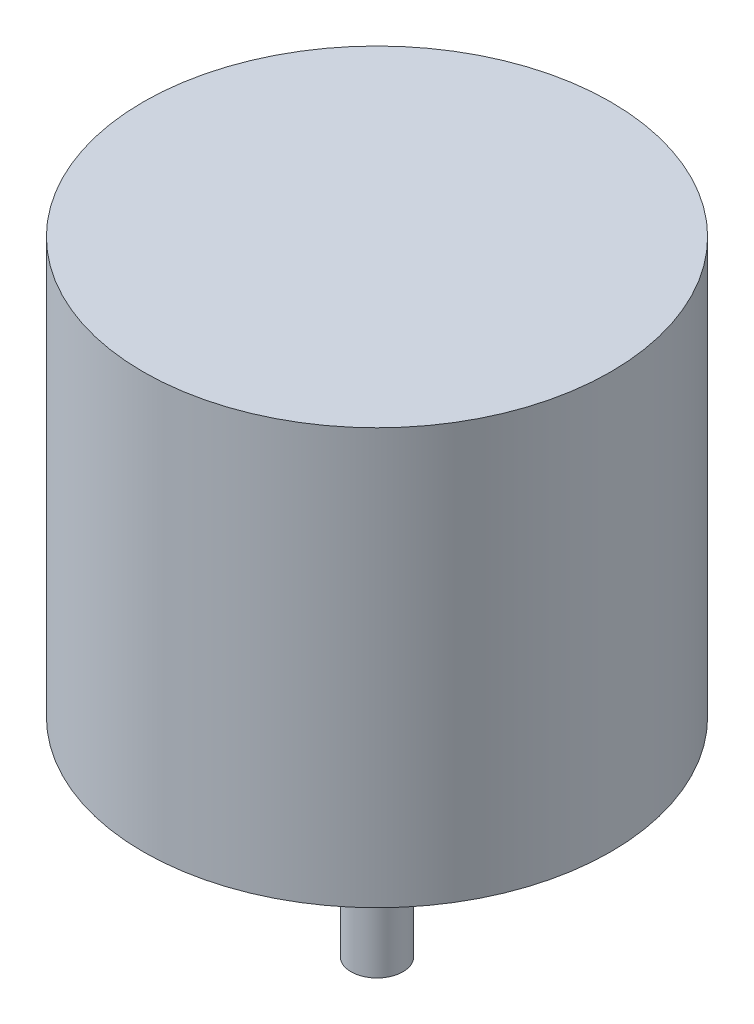
ISO-10303-21;
HEADER;
FILE_DESCRIPTION(('STEP AP214'),'2;1');
FILE_NAME('part.step','',(''),(''),'','','');
FILE_SCHEMA(('AUTOMOTIVE_DESIGN { 1 0 10303 214 1 1 1 1 }'));
ENDSEC;
DATA;
#1=APPLICATION_CONTEXT('core data for automotive mechanical design processes');
#2=APPLICATION_PROTOCOL_DEFINITION('international standard','automotive_design',2000,#1);
#3=PRODUCT_CONTEXT('',#1,'mechanical');
#4=PRODUCT('Part','Part','',(#3));
#5=PRODUCT_RELATED_PRODUCT_CATEGORY('part','',(#4));
#6=PRODUCT_DEFINITION_FORMATION('','',#4);
#7=PRODUCT_DEFINITION_CONTEXT('part definition',#1,'design');
#8=PRODUCT_DEFINITION('design','',#6,#7);
#9=PRODUCT_DEFINITION_SHAPE('','',#8);
#10=(LENGTH_UNIT() NAMED_UNIT(*) SI_UNIT(.MILLI.,.METRE.));
#11=(NAMED_UNIT(*) PLANE_ANGLE_UNIT() SI_UNIT($,.RADIAN.));
#12=(NAMED_UNIT(*) SI_UNIT($,.STERADIAN.) SOLID_ANGLE_UNIT());
#13=UNCERTAINTY_MEASURE_WITH_UNIT(LENGTH_MEASURE(1.E-05),#10,'distance_accuracy_value','');
#14=(GEOMETRIC_REPRESENTATION_CONTEXT(3) GLOBAL_UNCERTAINTY_ASSIGNED_CONTEXT((#13)) GLOBAL_UNIT_ASSIGNED_CONTEXT((#10,
#11,#12)) REPRESENTATION_CONTEXT('',''));
#15=CARTESIAN_POINT('',(0.,0.,0.));
#16=DIRECTION('',(0.,0.,1.));
#17=DIRECTION('',(1.,0.,0.));
#18=AXIS2_PLACEMENT_3D('',#15,#16,#17);
#19=CARTESIAN_POINT('',(0.,50.8,0.));
#20=DIRECTION('',(0.,-1.,0.));
#21=DIRECTION('',(0.,0.,-1.));
#22=AXIS2_PLACEMENT_3D('',#19,#20,#21);
#23=CYLINDRICAL_SURFACE('',#22,28.575);
#24=CARTESIAN_POINT('',(0.,50.8,0.));
#25=DIRECTION('',(0.,1.,0.));
#26=DIRECTION('',(0.,0.,1.));
#27=AXIS2_PLACEMENT_3D('',#24,#25,#26);
#28=CIRCLE('',#27,28.575);
#29=CARTESIAN_POINT('',(0.,50.8,28.575));
#30=VERTEX_POINT('',#29);
#31=EDGE_CURVE('E41',#30,#30,#28,.T.);
#32=ORIENTED_EDGE('',*,*,#31,.F.);
#33=EDGE_LOOP('',(#32));
#34=FACE_BOUND('',#33,.T.);
#35=CARTESIAN_POINT('',(0.,0.,0.));
#36=DIRECTION('',(0.,1.,0.));
#37=DIRECTION('',(0.,0.,1.));
#38=AXIS2_PLACEMENT_3D('',#35,#36,#37);
#39=CIRCLE('',#38,28.575);
#40=CARTESIAN_POINT('',(0.,0.,28.575));
#41=VERTEX_POINT('',#40);
#42=EDGE_CURVE('E45',#41,#41,#39,.T.);
#43=ORIENTED_EDGE('',*,*,#42,.T.);
#44=EDGE_LOOP('',(#43));
#45=FACE_BOUND('',#44,.T.);
#46=ADVANCED_FACE('F35',(#34,#45),#23,.T.);
#47=CARTESIAN_POINT('',(0.,50.8,0.));
#48=DIRECTION('',(0.,1.,0.));
#49=DIRECTION('',(0.,0.,1.));
#50=AXIS2_PLACEMENT_3D('',#47,#48,#49);
#51=PLANE('',#50);
#52=ORIENTED_EDGE('',*,*,#31,.T.);
#53=EDGE_LOOP('',(#52));
#54=FACE_BOUND('',#53,.T.);
#55=ADVANCED_FACE('F66',(#54),#51,.T.);
#56=CARTESIAN_POINT('',(0.,0.,0.));
#57=DIRECTION('',(0.,1.,0.));
#58=DIRECTION('',(0.,0.,1.));
#59=AXIS2_PLACEMENT_3D('',#56,#57,#58);
#60=PLANE('',#59);
#61=CARTESIAN_POINT('',(0.,0.,0.));
#62=DIRECTION('',(0.,1.,0.));
#63=DIRECTION('',(0.,0.,1.));
#64=AXIS2_PLACEMENT_3D('',#61,#62,#63);
#65=CIRCLE('',#64,3.175);
#66=CARTESIAN_POINT('',(0.,0.,3.175));
#67=VERTEX_POINT('',#66);
#68=EDGE_CURVE('E10',#67,#67,#65,.F.);
#69=ORIENTED_EDGE('',*,*,#68,.F.);
#70=EDGE_LOOP('',(#69));
#71=FACE_BOUND('',#70,.T.);
#72=ORIENTED_EDGE('',*,*,#42,.F.);
#73=EDGE_LOOP('',(#72));
#74=FACE_BOUND('',#73,.T.);
#75=ADVANCED_FACE('F59',(#71,#74),#60,.F.);
#76=CARTESIAN_POINT('',(0.,-25.4,0.));
#77=DIRECTION('',(0.,1.,0.));
#78=DIRECTION('',(0.,0.,1.));
#79=AXIS2_PLACEMENT_3D('',#76,#77,#78);
#80=CYLINDRICAL_SURFACE('',#79,3.175);
#81=CARTESIAN_POINT('',(0.,-25.4,0.));
#82=DIRECTION('',(0.,-1.,0.));
#83=DIRECTION('',(0.,0.,-1.));
#84=AXIS2_PLACEMENT_3D('',#81,#82,#83);
#85=CIRCLE('',#84,3.175);
#86=CARTESIAN_POINT('',(0.,-25.4,-3.175));
#87=VERTEX_POINT('',#86);
#88=EDGE_CURVE('E50',#87,#87,#85,.T.);
#89=ORIENTED_EDGE('',*,*,#88,.F.);
#90=EDGE_LOOP('',(#89));
#91=FACE_BOUND('',#90,.T.);
#92=ORIENTED_EDGE('',*,*,#68,.T.);
#93=EDGE_LOOP('',(#92));
#94=FACE_BOUND('',#93,.T.);
#95=ADVANCED_FACE('F57',(#91,#94),#80,.T.);
#96=CARTESIAN_POINT('',(0.,-25.4,0.));
#97=DIRECTION('',(0.,-1.,0.));
#98=DIRECTION('',(0.,0.,-1.));
#99=AXIS2_PLACEMENT_3D('',#96,#97,#98);
#100=PLANE('',#99);
#101=ORIENTED_EDGE('',*,*,#88,.T.);
#102=EDGE_LOOP('',(#101));
#103=FACE_BOUND('',#102,.T.);
#104=ADVANCED_FACE('F55',(#103),#100,.T.);
#105=CLOSED_SHELL('',(#46,#55,#75,#95,#104));
#106=MANIFOLD_SOLID_BREP('B2',#105);
#107=ADVANCED_BREP_SHAPE_REPRESENTATION('',(#18,#106),#14);
#108=SHAPE_DEFINITION_REPRESENTATION(#9,#107);
ENDSEC;
END-ISO-10303-21;
